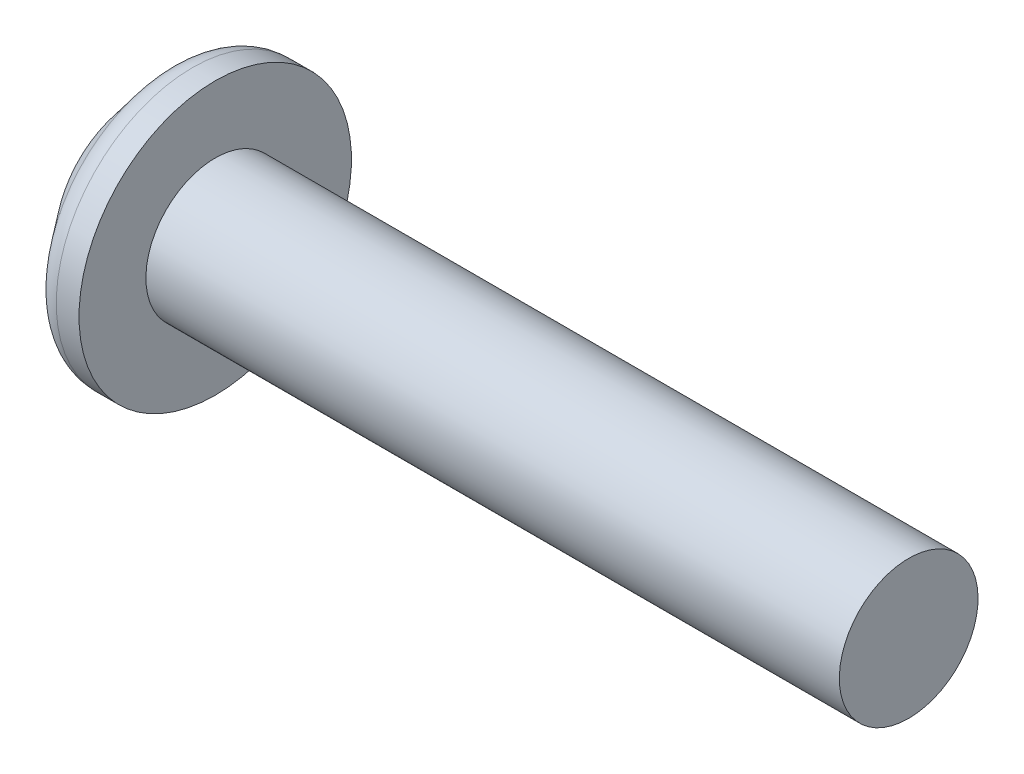
ISO-10303-21;
HEADER;
FILE_DESCRIPTION(('STEP AP214'),'2;1');
FILE_NAME('part.step','',(''),(''),'','','');
FILE_SCHEMA(('AUTOMOTIVE_DESIGN { 1 0 10303 214 1 1 1 1 }'));
ENDSEC;
DATA;
#1=APPLICATION_CONTEXT('core data for automotive mechanical design processes');
#2=APPLICATION_PROTOCOL_DEFINITION('international standard','automotive_design',2000,#1);
#3=PRODUCT_CONTEXT('',#1,'mechanical');
#4=PRODUCT('Part','Part','',(#3));
#5=PRODUCT_RELATED_PRODUCT_CATEGORY('part','',(#4));
#6=PRODUCT_DEFINITION_FORMATION('','',#4);
#7=PRODUCT_DEFINITION_CONTEXT('part definition',#1,'design');
#8=PRODUCT_DEFINITION('design','',#6,#7);
#9=PRODUCT_DEFINITION_SHAPE('','',#8);
#10=(LENGTH_UNIT() NAMED_UNIT(*) SI_UNIT(.MILLI.,.METRE.));
#11=(NAMED_UNIT(*) PLANE_ANGLE_UNIT() SI_UNIT($,.RADIAN.));
#12=(NAMED_UNIT(*) SI_UNIT($,.STERADIAN.) SOLID_ANGLE_UNIT());
#13=UNCERTAINTY_MEASURE_WITH_UNIT(LENGTH_MEASURE(1.E-05),#10,'distance_accuracy_value','');
#14=(GEOMETRIC_REPRESENTATION_CONTEXT(3) GLOBAL_UNCERTAINTY_ASSIGNED_CONTEXT((#13)) GLOBAL_UNIT_ASSIGNED_CONTEXT((#10,
#11,#12)) REPRESENTATION_CONTEXT('',''));
#15=CARTESIAN_POINT('',(0.,0.,0.));
#16=DIRECTION('',(0.,0.,1.));
#17=DIRECTION('',(1.,0.,0.));
#18=AXIS2_PLACEMENT_3D('',#15,#16,#17);
#19=CARTESIAN_POINT('',(0.,0.,0.));
#20=DIRECTION('',(1.,0.,0.));
#21=DIRECTION('',(0.,1.,0.));
#22=AXIS2_PLACEMENT_3D('',#19,#20,#21);
#23=PLANE('',#22);
#24=CARTESIAN_POINT('',(0.,0.,0.));
#25=DIRECTION('',(1.,0.,0.));
#26=DIRECTION('',(0.,1.,0.));
#27=AXIS2_PLACEMENT_3D('',#24,#25,#26);
#28=CIRCLE('',#27,1.32460947032089);
#29=CARTESIAN_POINT('',(0.,1.32460947032089,0.));
#30=VERTEX_POINT('',#29);
#31=EDGE_CURVE('E11',#30,#30,#28,.F.);
#32=ORIENTED_EDGE('',*,*,#31,.T.);
#33=EDGE_LOOP('',(#32));
#34=FACE_BOUND('',#33,.T.);
#35=DIRECTION('',(0.,0.866025403784439,-0.5));
#36=VECTOR('',#35,1.);
#37=CARTESIAN_POINT('',(0.,0.,1.15470053837925));
#38=LINE('',#37,#36);
#39=CARTESIAN_POINT('',(0.,0.,1.15470053837925));
#40=VERTEX_POINT('',#39);
#41=CARTESIAN_POINT('',(0.,1.,0.577350269189626));
#42=VERTEX_POINT('',#41);
#43=EDGE_CURVE('E131',#40,#42,#38,.T.);
#44=ORIENTED_EDGE('',*,*,#43,.F.);
#45=DIRECTION('',(0.,0.866025403784438,0.5));
#46=VECTOR('',#45,1.);
#47=CARTESIAN_POINT('',(0.,-1.,0.577350269189626));
#48=LINE('',#47,#46);
#49=CARTESIAN_POINT('',(0.,-1.,0.577350269189626));
#50=VERTEX_POINT('',#49);
#51=EDGE_CURVE('E57',#50,#40,#48,.T.);
#52=ORIENTED_EDGE('',*,*,#51,.F.);
#53=DIRECTION('',(0.,0.,1.));
#54=VECTOR('',#53,1.);
#55=CARTESIAN_POINT('',(0.,-1.,-0.577350269189625));
#56=LINE('',#55,#54);
#57=CARTESIAN_POINT('',(0.,-1.,-0.577350269189625));
#58=VERTEX_POINT('',#57);
#59=EDGE_CURVE('E140',#58,#50,#56,.T.);
#60=ORIENTED_EDGE('',*,*,#59,.F.);
#61=DIRECTION('',(0.,-0.866025403784439,0.5));
#62=VECTOR('',#61,1.);
#63=CARTESIAN_POINT('',(0.,0.,-1.15470053837925));
#64=LINE('',#63,#62);
#65=CARTESIAN_POINT('',(0.,0.,-1.15470053837925));
#66=VERTEX_POINT('',#65);
#67=EDGE_CURVE('E138',#66,#58,#64,.T.);
#68=ORIENTED_EDGE('',*,*,#67,.F.);
#69=DIRECTION('',(0.,-0.866025403784439,-0.5));
#70=VECTOR('',#69,1.);
#71=CARTESIAN_POINT('',(0.,1.,-0.577350269189626));
#72=LINE('',#71,#70);
#73=CARTESIAN_POINT('',(0.,1.,-0.577350269189626));
#74=VERTEX_POINT('',#73);
#75=EDGE_CURVE('E105',#74,#66,#72,.T.);
#76=ORIENTED_EDGE('',*,*,#75,.F.);
#77=DIRECTION('',(0.,0.,-1.));
#78=VECTOR('',#77,1.);
#79=CARTESIAN_POINT('',(0.,1.,0.577350269189626));
#80=LINE('',#79,#78);
#81=EDGE_CURVE('E134',#42,#74,#80,.T.);
#82=ORIENTED_EDGE('',*,*,#81,.F.);
#83=EDGE_LOOP('',(#44,#52,#60,#68,#76,#82));
#84=FACE_BOUND('',#83,.T.);
#85=ADVANCED_FACE('F42',(#34,#84),#23,.F.);
#86=CARTESIAN_POINT('',(1.,0.,0.));
#87=DIRECTION('',(1.,0.,0.));
#88=DIRECTION('',(0.,1.,0.));
#89=AXIS2_PLACEMENT_3D('',#86,#87,#88);
#90=CONICAL_SURFACE('',#89,2.75,0.896055384571344);
#91=CARTESIAN_POINT('',(0.84987801902177,0.,0.));
#92=DIRECTION('',(-1.,0.,0.));
#93=DIRECTION('',(0.,-1.,0.));
#94=AXIS2_PLACEMENT_3D('',#91,#92,#93);
#95=CIRCLE('',#94,2.56234752377721);
#96=CARTESIAN_POINT('',(0.84987801902177,-2.56234752377721,0.));
#97=VERTEX_POINT('',#96);
#98=EDGE_CURVE('E161',#97,#97,#95,.T.);
#99=ORIENTED_EDGE('',*,*,#98,.T.);
#100=EDGE_LOOP('',(#99));
#101=FACE_BOUND('',#100,.T.);
#102=CARTESIAN_POINT('',(0.109565595278485,0.,0.));
#103=DIRECTION('',(-1.,0.,0.));
#104=DIRECTION('',(0.,-1.,0.));
#105=AXIS2_PLACEMENT_3D('',#102,#103,#104);
#106=CIRCLE('',#105,1.63695699409811);
#107=CARTESIAN_POINT('',(0.109565595278485,-1.63695699409811,0.));
#108=VERTEX_POINT('',#107);
#109=EDGE_CURVE('E158',#108,#108,#106,.F.);
#110=ORIENTED_EDGE('',*,*,#109,.T.);
#111=EDGE_LOOP('',(#110));
#112=FACE_BOUND('',#111,.T.);
#113=ADVANCED_FACE('F174',(#101,#112),#90,.T.);
#114=CARTESIAN_POINT('',(0.,0.,0.));
#115=DIRECTION('',(-1.,0.,0.));
#116=DIRECTION('',(0.,-1.,0.));
#117=AXIS2_PLACEMENT_3D('',#114,#115,#116);
#118=CYLINDRICAL_SURFACE('',#117,2.75);
#119=CARTESIAN_POINT('',(1.24031242374328,0.,0.));
#120=DIRECTION('',(1.,0.,0.));
#121=DIRECTION('',(0.,1.,0.));
#122=AXIS2_PLACEMENT_3D('',#119,#120,#121);
#123=CIRCLE('',#122,2.75);
#124=CARTESIAN_POINT('',(1.24031242374328,2.75,0.));
#125=VERTEX_POINT('',#124);
#126=EDGE_CURVE('E50',#125,#125,#123,.T.);
#127=ORIENTED_EDGE('',*,*,#126,.T.);
#128=EDGE_LOOP('',(#127));
#129=FACE_BOUND('',#128,.T.);
#130=CARTESIAN_POINT('',(1.7,0.,0.));
#131=DIRECTION('',(-1.,0.,0.));
#132=DIRECTION('',(0.,-1.,0.));
#133=AXIS2_PLACEMENT_3D('',#130,#131,#132);
#134=CIRCLE('',#133,2.75);
#135=CARTESIAN_POINT('',(1.7,-2.75,0.));
#136=VERTEX_POINT('',#135);
#137=EDGE_CURVE('E155',#136,#136,#134,.T.);
#138=ORIENTED_EDGE('',*,*,#137,.T.);
#139=EDGE_LOOP('',(#138));
#140=FACE_BOUND('',#139,.T.);
#141=ADVANCED_FACE('F166',(#129,#140),#118,.T.);
#142=CARTESIAN_POINT('',(1.7,1.4,0.));
#143=DIRECTION('',(-1.,0.,0.));
#144=DIRECTION('',(0.,-1.,0.));
#145=AXIS2_PLACEMENT_3D('',#142,#143,#144);
#146=PLANE('',#145);
#147=ORIENTED_EDGE('',*,*,#137,.F.);
#148=EDGE_LOOP('',(#147));
#149=FACE_BOUND('',#148,.T.);
#150=CARTESIAN_POINT('',(1.7,0.,0.));
#151=DIRECTION('',(-1.,0.,0.));
#152=DIRECTION('',(0.,-1.,0.));
#153=AXIS2_PLACEMENT_3D('',#150,#151,#152);
#154=CIRCLE('',#153,1.4);
#155=CARTESIAN_POINT('',(1.7,-1.4,0.));
#156=VERTEX_POINT('',#155);
#157=EDGE_CURVE('E152',#156,#156,#154,.T.);
#158=ORIENTED_EDGE('',*,*,#157,.T.);
#159=EDGE_LOOP('',(#158));
#160=FACE_BOUND('',#159,.T.);
#161=ADVANCED_FACE('F211',(#149,#160),#146,.F.);
#162=CARTESIAN_POINT('',(0.,0.,0.));
#163=DIRECTION('',(-1.,0.,0.));
#164=DIRECTION('',(0.,-1.,0.));
#165=AXIS2_PLACEMENT_3D('',#162,#163,#164);
#166=CYLINDRICAL_SURFACE('',#165,1.4);
#167=ORIENTED_EDGE('',*,*,#157,.F.);
#168=EDGE_LOOP('',(#167));
#169=FACE_BOUND('',#168,.T.);
#170=CARTESIAN_POINT('',(15.7,0.,0.));
#171=DIRECTION('',(-1.,0.,0.));
#172=DIRECTION('',(0.,-1.,0.));
#173=AXIS2_PLACEMENT_3D('',#170,#171,#172);
#174=CIRCLE('',#173,1.4);
#175=CARTESIAN_POINT('',(15.7,-1.4,0.));
#176=VERTEX_POINT('',#175);
#177=EDGE_CURVE('E144',#176,#176,#174,.T.);
#178=ORIENTED_EDGE('',*,*,#177,.T.);
#179=EDGE_LOOP('',(#178));
#180=FACE_BOUND('',#179,.T.);
#181=ADVANCED_FACE('F203',(#169,#180),#166,.T.);
#182=CARTESIAN_POINT('',(15.7,0.,0.));
#183=DIRECTION('',(-1.,0.,0.));
#184=DIRECTION('',(0.,-1.,0.));
#185=AXIS2_PLACEMENT_3D('',#182,#183,#184);
#186=PLANE('',#185);
#187=ORIENTED_EDGE('',*,*,#177,.F.);
#188=EDGE_LOOP('',(#187));
#189=FACE_BOUND('',#188,.T.);
#190=ADVANCED_FACE('F196',(#189),#186,.F.);
#191=CARTESIAN_POINT('',(1.5,-1.,0.577350269189626));
#192=DIRECTION('',(0.,-0.5,0.866025403784439));
#193=DIRECTION('',(0.,-0.866025403784439,-0.5));
#194=AXIS2_PLACEMENT_3D('',#191,#192,#193);
#195=PLANE('',#194);
#196=ORIENTED_EDGE('',*,*,#51,.T.);
#197=DIRECTION('',(-1.,0.,0.));
#198=VECTOR('',#197,1.);
#199=CARTESIAN_POINT('',(1.5,0.,1.15470053837925));
#200=LINE('',#199,#198);
#201=CARTESIAN_POINT('',(1.5,0.,1.15470053837925));
#202=VERTEX_POINT('',#201);
#203=EDGE_CURVE('E87',#202,#40,#200,.T.);
#204=ORIENTED_EDGE('',*,*,#203,.F.);
#205=DIRECTION('',(0.,0.866025403784438,0.5));
#206=VECTOR('',#205,1.);
#207=CARTESIAN_POINT('',(1.5,-1.,0.577350269189626));
#208=LINE('',#207,#206);
#209=CARTESIAN_POINT('',(1.5,-1.,0.577350269189626));
#210=VERTEX_POINT('',#209);
#211=EDGE_CURVE('E142',#210,#202,#208,.T.);
#212=ORIENTED_EDGE('',*,*,#211,.F.);
#213=DIRECTION('',(-1.,0.,0.));
#214=VECTOR('',#213,1.);
#215=CARTESIAN_POINT('',(1.5,-1.,0.577350269189626));
#216=LINE('',#215,#214);
#217=EDGE_CURVE('E65',#210,#50,#216,.T.);
#218=ORIENTED_EDGE('',*,*,#217,.T.);
#219=EDGE_LOOP('',(#196,#204,#212,#218));
#220=FACE_BOUND('',#219,.T.);
#221=ADVANCED_FACE('F193',(#220),#195,.F.);
#222=CARTESIAN_POINT('',(1.5,-1.,-0.577350269189625));
#223=DIRECTION('',(0.,-1.,0.));
#224=DIRECTION('',(1.,0.,0.));
#225=AXIS2_PLACEMENT_3D('',#222,#223,#224);
#226=PLANE('',#225);
#227=ORIENTED_EDGE('',*,*,#59,.T.);
#228=ORIENTED_EDGE('',*,*,#217,.F.);
#229=DIRECTION('',(0.,0.,1.));
#230=VECTOR('',#229,1.);
#231=CARTESIAN_POINT('',(1.5,-1.,-0.577350269189625));
#232=LINE('',#231,#230);
#233=CARTESIAN_POINT('',(1.5,-1.,-0.577350269189625));
#234=VERTEX_POINT('',#233);
#235=EDGE_CURVE('E117',#234,#210,#232,.T.);
#236=ORIENTED_EDGE('',*,*,#235,.F.);
#237=DIRECTION('',(-1.,0.,0.));
#238=VECTOR('',#237,1.);
#239=CARTESIAN_POINT('',(1.5,-1.,-0.577350269189625));
#240=LINE('',#239,#238);
#241=EDGE_CURVE('E109',#234,#58,#240,.T.);
#242=ORIENTED_EDGE('',*,*,#241,.T.);
#243=EDGE_LOOP('',(#227,#228,#236,#242));
#244=FACE_BOUND('',#243,.T.);
#245=ADVANCED_FACE('F195',(#244),#226,.F.);
#246=CARTESIAN_POINT('',(1.5,0.,-1.15470053837925));
#247=DIRECTION('',(0.,-0.5,-0.866025403784438));
#248=DIRECTION('',(0.,0.866025403784439,-0.5));
#249=AXIS2_PLACEMENT_3D('',#246,#247,#248);
#250=PLANE('',#249);
#251=ORIENTED_EDGE('',*,*,#67,.T.);
#252=ORIENTED_EDGE('',*,*,#241,.F.);
#253=DIRECTION('',(0.,-0.866025403784439,0.5));
#254=VECTOR('',#253,1.);
#255=CARTESIAN_POINT('',(1.5,0.,-1.15470053837925));
#256=LINE('',#255,#254);
#257=CARTESIAN_POINT('',(1.5,0.,-1.15470053837925));
#258=VERTEX_POINT('',#257);
#259=EDGE_CURVE('E113',#258,#234,#256,.T.);
#260=ORIENTED_EDGE('',*,*,#259,.F.);
#261=DIRECTION('',(-1.,0.,0.));
#262=VECTOR('',#261,1.);
#263=CARTESIAN_POINT('',(1.5,0.,-1.15470053837925));
#264=LINE('',#263,#262);
#265=EDGE_CURVE('E98',#258,#66,#264,.T.);
#266=ORIENTED_EDGE('',*,*,#265,.T.);
#267=EDGE_LOOP('',(#251,#252,#260,#266));
#268=FACE_BOUND('',#267,.T.);
#269=ADVANCED_FACE('F114',(#268),#250,.F.);
#270=CARTESIAN_POINT('',(1.5,1.,-0.577350269189626));
#271=DIRECTION('',(0.,0.5,-0.866025403784439));
#272=DIRECTION('',(0.,0.866025403784439,0.5));
#273=AXIS2_PLACEMENT_3D('',#270,#271,#272);
#274=PLANE('',#273);
#275=ORIENTED_EDGE('',*,*,#75,.T.);
#276=ORIENTED_EDGE('',*,*,#265,.F.);
#277=DIRECTION('',(0.,-0.866025403784439,-0.5));
#278=VECTOR('',#277,1.);
#279=CARTESIAN_POINT('',(1.5,1.,-0.577350269189626));
#280=LINE('',#279,#278);
#281=CARTESIAN_POINT('',(1.5,1.,-0.577350269189626));
#282=VERTEX_POINT('',#281);
#283=EDGE_CURVE('E102',#282,#258,#280,.T.);
#284=ORIENTED_EDGE('',*,*,#283,.F.);
#285=DIRECTION('',(-1.,0.,0.));
#286=VECTOR('',#285,1.);
#287=CARTESIAN_POINT('',(1.5,1.,-0.577350269189626));
#288=LINE('',#287,#286);
#289=EDGE_CURVE('E110',#282,#74,#288,.T.);
#290=ORIENTED_EDGE('',*,*,#289,.T.);
#291=EDGE_LOOP('',(#275,#276,#284,#290));
#292=FACE_BOUND('',#291,.T.);
#293=ADVANCED_FACE('F100',(#292),#274,.F.);
#294=CARTESIAN_POINT('',(1.5,1.,0.577350269189626));
#295=DIRECTION('',(0.,1.,0.));
#296=DIRECTION('',(-1.,0.,0.));
#297=AXIS2_PLACEMENT_3D('',#294,#295,#296);
#298=PLANE('',#297);
#299=ORIENTED_EDGE('',*,*,#81,.T.);
#300=ORIENTED_EDGE('',*,*,#289,.F.);
#301=DIRECTION('',(0.,0.,-1.));
#302=VECTOR('',#301,1.);
#303=CARTESIAN_POINT('',(1.5,1.,0.577350269189626));
#304=LINE('',#303,#302);
#305=CARTESIAN_POINT('',(1.5,1.,0.577350269189626));
#306=VERTEX_POINT('',#305);
#307=EDGE_CURVE('E123',#306,#282,#304,.T.);
#308=ORIENTED_EDGE('',*,*,#307,.F.);
#309=DIRECTION('',(-1.,0.,0.));
#310=VECTOR('',#309,1.);
#311=CARTESIAN_POINT('',(1.5,1.,0.577350269189626));
#312=LINE('',#311,#310);
#313=EDGE_CURVE('E147',#306,#42,#312,.T.);
#314=ORIENTED_EDGE('',*,*,#313,.T.);
#315=EDGE_LOOP('',(#299,#300,#308,#314));
#316=FACE_BOUND('',#315,.T.);
#317=ADVANCED_FACE('F265',(#316),#298,.F.);
#318=CARTESIAN_POINT('',(1.5,0.,1.15470053837925));
#319=DIRECTION('',(0.,0.5,0.866025403784438));
#320=DIRECTION('',(0.,-0.866025403784439,0.5));
#321=AXIS2_PLACEMENT_3D('',#318,#319,#320);
#322=PLANE('',#321);
#323=ORIENTED_EDGE('',*,*,#43,.T.);
#324=ORIENTED_EDGE('',*,*,#313,.F.);
#325=DIRECTION('',(0.,0.866025403784439,-0.5));
#326=VECTOR('',#325,1.);
#327=CARTESIAN_POINT('',(1.5,0.,1.15470053837925));
#328=LINE('',#327,#326);
#329=EDGE_CURVE('E125',#202,#306,#328,.T.);
#330=ORIENTED_EDGE('',*,*,#329,.F.);
#331=ORIENTED_EDGE('',*,*,#203,.T.);
#332=EDGE_LOOP('',(#323,#324,#330,#331));
#333=FACE_BOUND('',#332,.T.);
#334=ADVANCED_FACE('F191',(#333),#322,.F.);
#335=CARTESIAN_POINT('',(1.5,0.,0.));
#336=DIRECTION('',(-1.,0.,0.));
#337=DIRECTION('',(0.,-1.,0.));
#338=AXIS2_PLACEMENT_3D('',#335,#336,#337);
#339=PLANE('',#338);
#340=ORIENTED_EDGE('',*,*,#211,.T.);
#341=ORIENTED_EDGE('',*,*,#329,.T.);
#342=ORIENTED_EDGE('',*,*,#307,.T.);
#343=ORIENTED_EDGE('',*,*,#283,.T.);
#344=ORIENTED_EDGE('',*,*,#259,.T.);
#345=ORIENTED_EDGE('',*,*,#235,.T.);
#346=EDGE_LOOP('',(#340,#341,#342,#343,#344,#345));
#347=FACE_BOUND('',#346,.T.);
#348=ADVANCED_FACE('F120',(#347),#339,.T.);
#349=CARTESIAN_POINT('',(1.24031242374328,0.,0.));
#350=DIRECTION('',(1.,0.,0.));
#351=DIRECTION('',(0.,1.,0.));
#352=AXIS2_PLACEMENT_3D('',#349,#350,#351);
#353=TOROIDAL_SURFACE('',#352,2.25,0.5);
#354=ORIENTED_EDGE('',*,*,#126,.F.);
#355=EDGE_LOOP('',(#354));
#356=FACE_BOUND('',#355,.T.);
#357=ORIENTED_EDGE('',*,*,#98,.F.);
#358=EDGE_LOOP('',(#357));
#359=FACE_BOUND('',#358,.T.);
#360=ADVANCED_FACE('F169',(#356,#359),#353,.T.);
#361=CARTESIAN_POINT('',(0.5,0.,0.));
#362=DIRECTION('',(1.,0.,0.));
#363=DIRECTION('',(0.,1.,0.));
#364=AXIS2_PLACEMENT_3D('',#361,#362,#363);
#365=TOROIDAL_SURFACE('',#364,1.32460947032089,0.5);
#366=ORIENTED_EDGE('',*,*,#109,.F.);
#367=EDGE_LOOP('',(#366));
#368=FACE_BOUND('',#367,.T.);
#369=ORIENTED_EDGE('',*,*,#31,.F.);
#370=EDGE_LOOP('',(#369));
#371=FACE_BOUND('',#370,.T.);
#372=ADVANCED_FACE('F44',(#368,#371),#365,.T.);
#373=CLOSED_SHELL('',(#85,#113,#141,#161,#181,#190,#221,#245,#269,#293,#317,#334,#348,#360,#372));
#374=MANIFOLD_SOLID_BREP('B2',#373);
#375=ADVANCED_BREP_SHAPE_REPRESENTATION('',(#18,#374),#14);
#376=SHAPE_DEFINITION_REPRESENTATION(#9,#375);
ENDSEC;
END-ISO-10303-21;
